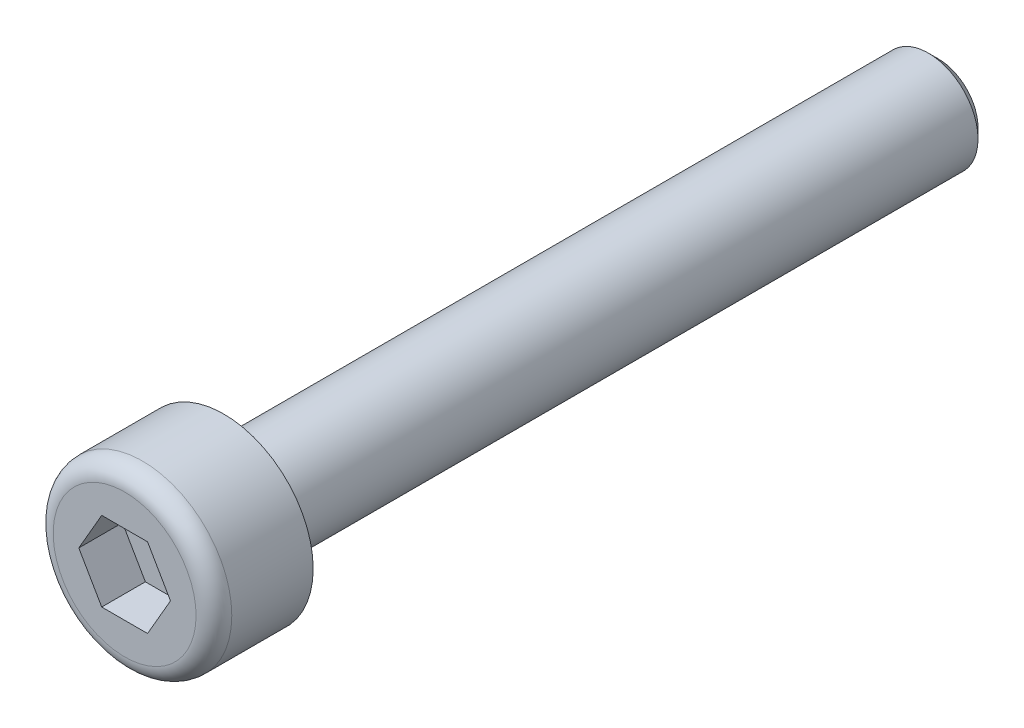
ISO-10303-21;
HEADER;
FILE_DESCRIPTION(('STEP AP214'),'2;1');
FILE_NAME('part.step','',(''),(''),'','','');
FILE_SCHEMA(('AUTOMOTIVE_DESIGN { 1 0 10303 214 1 1 1 1 }'));
ENDSEC;
DATA;
#1=APPLICATION_CONTEXT('core data for automotive mechanical design processes');
#2=APPLICATION_PROTOCOL_DEFINITION('international standard','automotive_design',2000,#1);
#3=PRODUCT_CONTEXT('',#1,'mechanical');
#4=PRODUCT('Part','Part','',(#3));
#5=PRODUCT_RELATED_PRODUCT_CATEGORY('part','',(#4));
#6=PRODUCT_DEFINITION_FORMATION('','',#4);
#7=PRODUCT_DEFINITION_CONTEXT('part definition',#1,'design');
#8=PRODUCT_DEFINITION('design','',#6,#7);
#9=PRODUCT_DEFINITION_SHAPE('','',#8);
#10=(LENGTH_UNIT() NAMED_UNIT(*) SI_UNIT(.MILLI.,.METRE.));
#11=(NAMED_UNIT(*) PLANE_ANGLE_UNIT() SI_UNIT($,.RADIAN.));
#12=(NAMED_UNIT(*) SI_UNIT($,.STERADIAN.) SOLID_ANGLE_UNIT());
#13=UNCERTAINTY_MEASURE_WITH_UNIT(LENGTH_MEASURE(1.E-05),#10,'distance_accuracy_value','');
#14=(GEOMETRIC_REPRESENTATION_CONTEXT(3) GLOBAL_UNCERTAINTY_ASSIGNED_CONTEXT((#13)) GLOBAL_UNIT_ASSIGNED_CONTEXT((#10,
#11,#12)) REPRESENTATION_CONTEXT('',''));
#15=CARTESIAN_POINT('',(0.,0.,0.));
#16=DIRECTION('',(0.,0.,1.));
#17=DIRECTION('',(1.,0.,0.));
#18=AXIS2_PLACEMENT_3D('',#15,#16,#17);
#19=CARTESIAN_POINT('',(0.,0.,1.4));
#20=DIRECTION('',(0.,0.,1.));
#21=DIRECTION('',(1.,0.,0.));
#22=AXIS2_PLACEMENT_3D('',#19,#20,#21);
#23=PLANE('',#22);
#24=DIRECTION('',(-0.50000000000019,0.866025403784329,0.));
#25=VECTOR('',#24,1.);
#26=CARTESIAN_POINT('',(1.155,0.,1.4));
#27=LINE('',#26,#25);
#28=CARTESIAN_POINT('',(1.155,0.,1.4));
#29=VERTEX_POINT('',#28);
#30=CARTESIAN_POINT('',(0.5775,1.000259341371,1.4));
#31=VERTEX_POINT('',#30);
#32=EDGE_CURVE('E10',#29,#31,#27,.T.);
#33=ORIENTED_EDGE('',*,*,#32,.T.);
#34=DIRECTION('',(-1.,0.,0.));
#35=VECTOR('',#34,1.);
#36=CARTESIAN_POINT('',(0.5775,1.000259341371,1.4));
#37=LINE('',#36,#35);
#38=CARTESIAN_POINT('',(-0.5775,1.000259341371,1.4));
#39=VERTEX_POINT('',#38);
#40=EDGE_CURVE('E24',#31,#39,#37,.T.);
#41=ORIENTED_EDGE('',*,*,#40,.T.);
#42=DIRECTION('',(-0.50000000000019,-0.866025403784329,0.));
#43=VECTOR('',#42,1.);
#44=CARTESIAN_POINT('',(-0.5775,1.000259341371,1.4));
#45=LINE('',#44,#43);
#46=CARTESIAN_POINT('',(-1.155,0.,1.4));
#47=VERTEX_POINT('',#46);
#48=EDGE_CURVE('E171',#39,#47,#45,.T.);
#49=ORIENTED_EDGE('',*,*,#48,.T.);
#50=DIRECTION('',(0.50000000000019,-0.866025403784329,0.));
#51=VECTOR('',#50,1.);
#52=CARTESIAN_POINT('',(-1.155,0.,1.4));
#53=LINE('',#52,#51);
#54=CARTESIAN_POINT('',(-0.5775,-1.000259341371,1.4));
#55=VERTEX_POINT('',#54);
#56=EDGE_CURVE('E164',#47,#55,#53,.T.);
#57=ORIENTED_EDGE('',*,*,#56,.T.);
#58=DIRECTION('',(1.,0.,0.));
#59=VECTOR('',#58,1.);
#60=CARTESIAN_POINT('',(-0.5775,-1.000259341371,1.4));
#61=LINE('',#60,#59);
#62=CARTESIAN_POINT('',(0.5775,-1.000259341371,1.4));
#63=VERTEX_POINT('',#62);
#64=EDGE_CURVE('E114',#55,#63,#61,.T.);
#65=ORIENTED_EDGE('',*,*,#64,.T.);
#66=DIRECTION('',(0.50000000000019,0.866025403784329,0.));
#67=VECTOR('',#66,1.);
#68=CARTESIAN_POINT('',(0.5775,-1.000259341371,1.4));
#69=LINE('',#68,#67);
#70=EDGE_CURVE('E117',#63,#29,#69,.T.);
#71=ORIENTED_EDGE('',*,*,#70,.T.);
#72=EDGE_LOOP('',(#33,#41,#49,#57,#65,#71));
#73=FACE_BOUND('',#72,.T.);
#74=ADVANCED_FACE('F16',(#73),#23,.T.);
#75=CARTESIAN_POINT('',(1.155,0.,1.4));
#76=DIRECTION('',(-0.866025403784329,-0.50000000000019,0.));
#77=DIRECTION('',(-0.50000000000019,0.866025403784329,0.));
#78=AXIS2_PLACEMENT_3D('',#75,#76,#77);
#79=PLANE('',#78);
#80=DIRECTION('',(0.,0.,1.));
#81=VECTOR('',#80,1.);
#82=CARTESIAN_POINT('',(1.155,0.,1.4));
#83=LINE('',#82,#81);
#84=CARTESIAN_POINT('',(1.155,0.,2.5));
#85=VERTEX_POINT('',#84);
#86=EDGE_CURVE('E156',#29,#85,#83,.T.);
#87=ORIENTED_EDGE('',*,*,#86,.T.);
#88=DIRECTION('',(-0.50000000000019,0.866025403784329,0.));
#89=VECTOR('',#88,1.);
#90=CARTESIAN_POINT('',(1.155,0.,2.5));
#91=LINE('',#90,#89);
#92=CARTESIAN_POINT('',(0.5775,1.000259341371,2.5));
#93=VERTEX_POINT('',#92);
#94=EDGE_CURVE('E144',#85,#93,#91,.T.);
#95=ORIENTED_EDGE('',*,*,#94,.T.);
#96=DIRECTION('',(0.,0.,1.));
#97=VECTOR('',#96,1.);
#98=CARTESIAN_POINT('',(0.5775,1.000259341371,1.4));
#99=LINE('',#98,#97);
#100=EDGE_CURVE('E173',#31,#93,#99,.T.);
#101=ORIENTED_EDGE('',*,*,#100,.F.);
#102=ORIENTED_EDGE('',*,*,#32,.F.);
#103=EDGE_LOOP('',(#87,#95,#101,#102));
#104=FACE_BOUND('',#103,.T.);
#105=ADVANCED_FACE('F282',(#104),#79,.T.);
#106=CARTESIAN_POINT('',(0.5775,1.000259341371,1.4));
#107=DIRECTION('',(0.,-1.,0.));
#108=DIRECTION('',(-1.,0.,0.));
#109=AXIS2_PLACEMENT_3D('',#106,#107,#108);
#110=PLANE('',#109);
#111=ORIENTED_EDGE('',*,*,#100,.T.);
#112=DIRECTION('',(-1.,0.,0.));
#113=VECTOR('',#112,1.);
#114=CARTESIAN_POINT('',(0.5775,1.000259341371,2.5));
#115=LINE('',#114,#113);
#116=CARTESIAN_POINT('',(-0.5775,1.000259341371,2.5));
#117=VERTEX_POINT('',#116);
#118=EDGE_CURVE('E147',#93,#117,#115,.T.);
#119=ORIENTED_EDGE('',*,*,#118,.T.);
#120=DIRECTION('',(0.,0.,1.));
#121=VECTOR('',#120,1.);
#122=CARTESIAN_POINT('',(-0.5775,1.000259341371,1.4));
#123=LINE('',#122,#121);
#124=EDGE_CURVE('E169',#39,#117,#123,.T.);
#125=ORIENTED_EDGE('',*,*,#124,.F.);
#126=ORIENTED_EDGE('',*,*,#40,.F.);
#127=EDGE_LOOP('',(#111,#119,#125,#126));
#128=FACE_BOUND('',#127,.T.);
#129=ADVANCED_FACE('F272',(#128),#110,.T.);
#130=CARTESIAN_POINT('',(-0.5775,1.000259341371,1.4));
#131=DIRECTION('',(0.866025403784329,-0.50000000000019,0.));
#132=DIRECTION('',(0.,0.,-1.));
#133=AXIS2_PLACEMENT_3D('',#130,#131,#132);
#134=PLANE('',#133);
#135=ORIENTED_EDGE('',*,*,#124,.T.);
#136=DIRECTION('',(-0.50000000000019,-0.866025403784329,0.));
#137=VECTOR('',#136,1.);
#138=CARTESIAN_POINT('',(-0.5775,1.000259341371,2.5));
#139=LINE('',#138,#137);
#140=CARTESIAN_POINT('',(-1.155,0.,2.5));
#141=VERTEX_POINT('',#140);
#142=EDGE_CURVE('E128',#117,#141,#139,.T.);
#143=ORIENTED_EDGE('',*,*,#142,.T.);
#144=DIRECTION('',(0.,0.,1.));
#145=VECTOR('',#144,1.);
#146=CARTESIAN_POINT('',(-1.155,0.,1.4));
#147=LINE('',#146,#145);
#148=EDGE_CURVE('E123',#47,#141,#147,.T.);
#149=ORIENTED_EDGE('',*,*,#148,.F.);
#150=ORIENTED_EDGE('',*,*,#48,.F.);
#151=EDGE_LOOP('',(#135,#143,#149,#150));
#152=FACE_BOUND('',#151,.T.);
#153=ADVANCED_FACE('F218',(#152),#134,.T.);
#154=CARTESIAN_POINT('',(-1.155,0.,1.4));
#155=DIRECTION('',(0.866025403784329,0.50000000000019,0.));
#156=DIRECTION('',(0.,0.,-1.));
#157=AXIS2_PLACEMENT_3D('',#154,#155,#156);
#158=PLANE('',#157);
#159=ORIENTED_EDGE('',*,*,#148,.T.);
#160=DIRECTION('',(0.50000000000019,-0.866025403784329,0.));
#161=VECTOR('',#160,1.);
#162=CARTESIAN_POINT('',(-1.155,0.,2.5));
#163=LINE('',#162,#161);
#164=CARTESIAN_POINT('',(-0.5775,-1.000259341371,2.5));
#165=VERTEX_POINT('',#164);
#166=EDGE_CURVE('E120',#141,#165,#163,.T.);
#167=ORIENTED_EDGE('',*,*,#166,.T.);
#168=DIRECTION('',(0.,0.,1.));
#169=VECTOR('',#168,1.);
#170=CARTESIAN_POINT('',(-0.5775,-1.000259341371,1.4));
#171=LINE('',#170,#169);
#172=EDGE_CURVE('E110',#55,#165,#171,.T.);
#173=ORIENTED_EDGE('',*,*,#172,.F.);
#174=ORIENTED_EDGE('',*,*,#56,.F.);
#175=EDGE_LOOP('',(#159,#167,#173,#174));
#176=FACE_BOUND('',#175,.T.);
#177=ADVANCED_FACE('F121',(#176),#158,.T.);
#178=CARTESIAN_POINT('',(-0.5775,-1.000259341371,1.4));
#179=DIRECTION('',(0.,1.,0.));
#180=DIRECTION('',(1.,0.,0.));
#181=AXIS2_PLACEMENT_3D('',#178,#179,#180);
#182=PLANE('',#181);
#183=ORIENTED_EDGE('',*,*,#172,.T.);
#184=DIRECTION('',(1.,0.,0.));
#185=VECTOR('',#184,1.);
#186=CARTESIAN_POINT('',(-0.5775,-1.000259341371,2.5));
#187=LINE('',#186,#185);
#188=CARTESIAN_POINT('',(0.5775,-1.000259341371,2.5));
#189=VERTEX_POINT('',#188);
#190=EDGE_CURVE('E115',#165,#189,#187,.T.);
#191=ORIENTED_EDGE('',*,*,#190,.T.);
#192=DIRECTION('',(0.,0.,1.));
#193=VECTOR('',#192,1.);
#194=CARTESIAN_POINT('',(0.5775,-1.000259341371,1.4));
#195=LINE('',#194,#193);
#196=EDGE_CURVE('E153',#63,#189,#195,.T.);
#197=ORIENTED_EDGE('',*,*,#196,.F.);
#198=ORIENTED_EDGE('',*,*,#64,.F.);
#199=EDGE_LOOP('',(#183,#191,#197,#198));
#200=FACE_BOUND('',#199,.T.);
#201=ADVANCED_FACE('F108',(#200),#182,.T.);
#202=CARTESIAN_POINT('',(0.5775,-1.000259341371,1.4));
#203=DIRECTION('',(-0.866025403784329,0.50000000000019,0.));
#204=DIRECTION('',(0.,0.,1.));
#205=AXIS2_PLACEMENT_3D('',#202,#203,#204);
#206=PLANE('',#205);
#207=ORIENTED_EDGE('',*,*,#196,.T.);
#208=DIRECTION('',(0.50000000000019,0.866025403784329,0.));
#209=VECTOR('',#208,1.);
#210=CARTESIAN_POINT('',(0.5775,-1.000259341371,2.5));
#211=LINE('',#210,#209);
#212=EDGE_CURVE('E134',#189,#85,#211,.T.);
#213=ORIENTED_EDGE('',*,*,#212,.T.);
#214=ORIENTED_EDGE('',*,*,#86,.F.);
#215=ORIENTED_EDGE('',*,*,#70,.F.);
#216=EDGE_LOOP('',(#207,#213,#214,#215));
#217=FACE_BOUND('',#216,.T.);
#218=ADVANCED_FACE('F194',(#217),#206,.T.);
#219=CARTESIAN_POINT('',(0.,0.,2.5));
#220=DIRECTION('',(0.,0.,1.));
#221=DIRECTION('',(1.,0.,0.));
#222=AXIS2_PLACEMENT_3D('',#219,#220,#221);
#223=PLANE('',#222);
#224=ORIENTED_EDGE('',*,*,#190,.F.);
#225=ORIENTED_EDGE('',*,*,#166,.F.);
#226=ORIENTED_EDGE('',*,*,#142,.F.);
#227=ORIENTED_EDGE('',*,*,#118,.F.);
#228=ORIENTED_EDGE('',*,*,#94,.F.);
#229=ORIENTED_EDGE('',*,*,#212,.F.);
#230=EDGE_LOOP('',(#224,#225,#226,#227,#228,#229));
#231=FACE_BOUND('',#230,.T.);
#232=CARTESIAN_POINT('',(0.,0.,2.5));
#233=DIRECTION('',(0.,0.,1.));
#234=DIRECTION('',(1.,0.,0.));
#235=AXIS2_PLACEMENT_3D('',#232,#233,#234);
#236=CIRCLE('',#235,1.8);
#237=CARTESIAN_POINT('',(1.8,0.,2.5));
#238=VERTEX_POINT('',#237);
#239=EDGE_CURVE('E140',#238,#238,#236,.T.);
#240=ORIENTED_EDGE('',*,*,#239,.T.);
#241=EDGE_LOOP('',(#240));
#242=FACE_BOUND('',#241,.T.);
#243=ADVANCED_FACE('F131',(#231,#242),#223,.T.);
#244=CARTESIAN_POINT('',(0.,0.,2.05));
#245=DIRECTION('',(0.,0.,1.));
#246=DIRECTION('',(1.,0.,0.));
#247=AXIS2_PLACEMENT_3D('',#244,#245,#246);
#248=TOROIDAL_SURFACE('',#247,1.8,0.45);
#249=CARTESIAN_POINT('',(0.,0.,2.05));
#250=DIRECTION('',(0.,0.,1.));
#251=DIRECTION('',(1.,0.,0.));
#252=AXIS2_PLACEMENT_3D('',#249,#250,#251);
#253=CIRCLE('',#252,2.25);
#254=CARTESIAN_POINT('',(2.25,0.,2.05));
#255=VERTEX_POINT('',#254);
#256=EDGE_CURVE('E337',#255,#255,#253,.T.);
#257=ORIENTED_EDGE('',*,*,#256,.T.);
#258=CARTESIAN_POINT('',(1.8,0.,2.05));
#259=DIRECTION('',(0.,-1.,0.));
#260=DIRECTION('',(1.,0.,0.));
#261=AXIS2_PLACEMENT_3D('',#258,#259,#260);
#262=CIRCLE('',#261,0.45);
#263=EDGE_CURVE('E142',#255,#238,#262,.T.);
#264=ORIENTED_EDGE('',*,*,#263,.T.);
#265=ORIENTED_EDGE('',*,*,#239,.F.);
#266=ORIENTED_EDGE('',*,*,#263,.F.);
#267=EDGE_LOOP('',(#257,#264,#265,#266));
#268=FACE_BOUND('',#267,.T.);
#269=ADVANCED_FACE('F244',(#268),#248,.T.);
#270=CARTESIAN_POINT('',(0.,0.,0.));
#271=DIRECTION('',(0.,0.,1.));
#272=DIRECTION('',(1.,0.,0.));
#273=AXIS2_PLACEMENT_3D('',#270,#271,#272);
#274=CYLINDRICAL_SURFACE('',#273,2.25);
#275=CARTESIAN_POINT('',(0.,0.,0.));
#276=DIRECTION('',(0.,0.,1.));
#277=DIRECTION('',(1.,0.,0.));
#278=AXIS2_PLACEMENT_3D('',#275,#276,#277);
#279=CIRCLE('',#278,2.25);
#280=CARTESIAN_POINT('',(2.25,0.,0.));
#281=VERTEX_POINT('',#280);
#282=EDGE_CURVE('E339',#281,#281,#279,.T.);
#283=ORIENTED_EDGE('',*,*,#282,.T.);
#284=DIRECTION('',(0.,0.,1.));
#285=VECTOR('',#284,1.);
#286=CARTESIAN_POINT('',(2.25,0.,0.));
#287=LINE('',#286,#285);
#288=EDGE_CURVE('E331',#281,#255,#287,.T.);
#289=ORIENTED_EDGE('',*,*,#288,.T.);
#290=ORIENTED_EDGE('',*,*,#256,.F.);
#291=ORIENTED_EDGE('',*,*,#288,.F.);
#292=EDGE_LOOP('',(#283,#289,#290,#291));
#293=FACE_BOUND('',#292,.T.);
#294=ADVANCED_FACE('F240',(#293),#274,.T.);
#295=CARTESIAN_POINT('',(0.,0.,0.));
#296=DIRECTION('',(0.,0.,1.));
#297=DIRECTION('',(1.,0.,0.));
#298=AXIS2_PLACEMENT_3D('',#295,#296,#297);
#299=PLANE('',#298);
#300=ORIENTED_EDGE('',*,*,#282,.F.);
#301=EDGE_LOOP('',(#300));
#302=FACE_BOUND('',#301,.T.);
#303=CARTESIAN_POINT('',(0.,0.,0.));
#304=DIRECTION('',(0.,0.,1.));
#305=DIRECTION('',(1.,0.,0.));
#306=AXIS2_PLACEMENT_3D('',#303,#304,#305);
#307=CIRCLE('',#306,1.25);
#308=CARTESIAN_POINT('',(1.25,0.,0.));
#309=VERTEX_POINT('',#308);
#310=EDGE_CURVE('E332',#309,#309,#307,.T.);
#311=ORIENTED_EDGE('',*,*,#310,.T.);
#312=EDGE_LOOP('',(#311));
#313=FACE_BOUND('',#312,.T.);
#314=ADVANCED_FACE('F227',(#302,#313),#299,.F.);
#315=CARTESIAN_POINT('',(0.,0.,-17.75));
#316=DIRECTION('',(0.,0.,1.));
#317=DIRECTION('',(1.,0.,0.));
#318=AXIS2_PLACEMENT_3D('',#315,#316,#317);
#319=CYLINDRICAL_SURFACE('',#318,1.25);
#320=CARTESIAN_POINT('',(0.,0.,-17.75));
#321=DIRECTION('',(0.,0.,1.));
#322=DIRECTION('',(1.,0.,0.));
#323=AXIS2_PLACEMENT_3D('',#320,#321,#322);
#324=CIRCLE('',#323,1.25);
#325=CARTESIAN_POINT('',(1.25,0.,-17.75));
#326=VERTEX_POINT('',#325);
#327=EDGE_CURVE('E351',#326,#326,#324,.T.);
#328=ORIENTED_EDGE('',*,*,#327,.T.);
#329=DIRECTION('',(0.,0.,1.));
#330=VECTOR('',#329,1.);
#331=CARTESIAN_POINT('',(1.25,0.,-17.75));
#332=LINE('',#331,#330);
#333=EDGE_CURVE('E348',#326,#309,#332,.T.);
#334=ORIENTED_EDGE('',*,*,#333,.T.);
#335=ORIENTED_EDGE('',*,*,#310,.F.);
#336=ORIENTED_EDGE('',*,*,#333,.F.);
#337=EDGE_LOOP('',(#328,#334,#335,#336));
#338=FACE_BOUND('',#337,.T.);
#339=ADVANCED_FACE('F207',(#338),#319,.T.);
#340=CARTESIAN_POINT('',(0.,0.,-18.));
#341=DIRECTION('',(0.,0.,1.));
#342=DIRECTION('',(1.,0.,0.));
#343=AXIS2_PLACEMENT_3D('',#340,#341,#342);
#344=CONICAL_SURFACE('',#343,1.,0.785398163397);
#345=CARTESIAN_POINT('',(0.,0.,-18.));
#346=DIRECTION('',(0.,0.,1.));
#347=DIRECTION('',(1.,0.,0.));
#348=AXIS2_PLACEMENT_3D('',#345,#346,#347);
#349=CIRCLE('',#348,1.);
#350=CARTESIAN_POINT('',(1.,0.,-18.));
#351=VERTEX_POINT('',#350);
#352=EDGE_CURVE('E357',#351,#351,#349,.T.);
#353=ORIENTED_EDGE('',*,*,#352,.T.);
#354=DIRECTION('',(0.707106781186548,0.,0.707106781186548));
#355=VECTOR('',#354,1.);
#356=CARTESIAN_POINT('',(1.,0.,-18.));
#357=LINE('',#356,#355);
#358=EDGE_CURVE('E354',#351,#326,#357,.T.);
#359=ORIENTED_EDGE('',*,*,#358,.T.);
#360=ORIENTED_EDGE('',*,*,#327,.F.);
#361=ORIENTED_EDGE('',*,*,#358,.F.);
#362=EDGE_LOOP('',(#353,#359,#360,#361));
#363=FACE_BOUND('',#362,.T.);
#364=ADVANCED_FACE('F187',(#363),#344,.T.);
#365=CARTESIAN_POINT('',(0.,0.,-18.));
#366=DIRECTION('',(0.,0.,1.));
#367=DIRECTION('',(1.,0.,0.));
#368=AXIS2_PLACEMENT_3D('',#365,#366,#367);
#369=PLANE('',#368);
#370=ORIENTED_EDGE('',*,*,#352,.F.);
#371=EDGE_LOOP('',(#370));
#372=FACE_BOUND('',#371,.T.);
#373=ADVANCED_FACE('F183',(#372),#369,.F.);
#374=CLOSED_SHELL('',(#74,#105,#129,#153,#177,#201,#218,#243,#269,#294,#314,#339,#364,#373));
#375=MANIFOLD_SOLID_BREP('B1',#374);
#376=ADVANCED_BREP_SHAPE_REPRESENTATION('',(#18,#375),#14);
#377=SHAPE_DEFINITION_REPRESENTATION(#9,#376);
ENDSEC;
END-ISO-10303-21;
